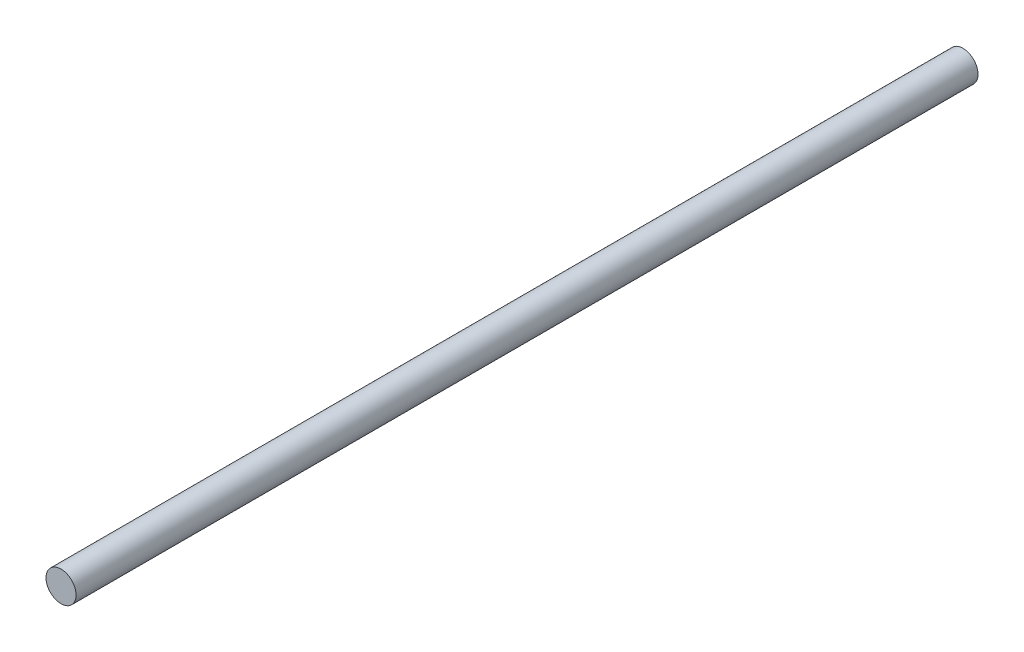
ISO-10303-21;
HEADER;
FILE_DESCRIPTION(('STEP AP214'),'2;1');
FILE_NAME('part.step','',(''),(''),'','','');
FILE_SCHEMA(('AUTOMOTIVE_DESIGN { 1 0 10303 214 1 1 1 1 }'));
ENDSEC;
DATA;
#1=APPLICATION_CONTEXT('core data for automotive mechanical design processes');
#2=APPLICATION_PROTOCOL_DEFINITION('international standard','automotive_design',2000,#1);
#3=PRODUCT_CONTEXT('',#1,'mechanical');
#4=PRODUCT('Part','Part','',(#3));
#5=PRODUCT_RELATED_PRODUCT_CATEGORY('part','',(#4));
#6=PRODUCT_DEFINITION_FORMATION('','',#4);
#7=PRODUCT_DEFINITION_CONTEXT('part definition',#1,'design');
#8=PRODUCT_DEFINITION('design','',#6,#7);
#9=PRODUCT_DEFINITION_SHAPE('','',#8);
#10=(LENGTH_UNIT() NAMED_UNIT(*) SI_UNIT(.MILLI.,.METRE.));
#11=(NAMED_UNIT(*) PLANE_ANGLE_UNIT() SI_UNIT($,.RADIAN.));
#12=(NAMED_UNIT(*) SI_UNIT($,.STERADIAN.) SOLID_ANGLE_UNIT());
#13=UNCERTAINTY_MEASURE_WITH_UNIT(LENGTH_MEASURE(1.E-05),#10,'distance_accuracy_value','');
#14=(GEOMETRIC_REPRESENTATION_CONTEXT(3) GLOBAL_UNCERTAINTY_ASSIGNED_CONTEXT((#13)) GLOBAL_UNIT_ASSIGNED_CONTEXT((#10,
#11,#12)) REPRESENTATION_CONTEXT('',''));
#15=CARTESIAN_POINT('',(0.,0.,0.));
#16=DIRECTION('',(0.,0.,1.));
#17=DIRECTION('',(1.,0.,0.));
#18=AXIS2_PLACEMENT_3D('',#15,#16,#17);
#19=CARTESIAN_POINT('',(0.,0.,90.));
#20=DIRECTION('',(0.,0.,-1.));
#21=DIRECTION('',(-1.,0.,0.));
#22=AXIS2_PLACEMENT_3D('',#19,#20,#21);
#23=CYLINDRICAL_SURFACE('',#22,1.5);
#24=CARTESIAN_POINT('',(0.,0.,90.));
#25=DIRECTION('',(0.,0.,1.));
#26=DIRECTION('',(1.,0.,0.));
#27=AXIS2_PLACEMENT_3D('',#24,#25,#26);
#28=CIRCLE('',#27,1.5);
#29=CARTESIAN_POINT('',(-1.5,0.,90.));
#30=VERTEX_POINT('',#29);
#31=EDGE_CURVE('E10',#30,#30,#28,.T.);
#32=CARTESIAN_POINT('',(0.,0.,0.));
#33=DIRECTION('',(0.,0.,1.));
#34=DIRECTION('',(1.,0.,0.));
#35=AXIS2_PLACEMENT_3D('',#32,#33,#34);
#36=CIRCLE('',#35,1.5);
#37=CARTESIAN_POINT('',(-1.5,0.,0.));
#38=VERTEX_POINT('',#37);
#39=EDGE_CURVE('E40',#38,#38,#36,.T.);
#40=CARTESIAN_POINT('',(-1.5,0.,90.));
#41=CARTESIAN_POINT('',(-1.5,0.,89.0625));
#42=CARTESIAN_POINT('',(-1.5,0.,88.125));
#43=CARTESIAN_POINT('',(-1.5,0.,86.25));
#44=CARTESIAN_POINT('',(-1.5,0.,85.3125));
#45=CARTESIAN_POINT('',(-1.5,0.,83.4375));
#46=CARTESIAN_POINT('',(-1.5,0.,82.5));
#47=CARTESIAN_POINT('',(-1.5,0.,80.625));
#48=CARTESIAN_POINT('',(-1.5,0.,79.6875));
#49=CARTESIAN_POINT('',(-1.5,0.,77.8125));
#50=CARTESIAN_POINT('',(-1.5,0.,76.875));
#51=CARTESIAN_POINT('',(-1.5,0.,75.));
#52=CARTESIAN_POINT('',(-1.5,0.,74.0625));
#53=CARTESIAN_POINT('',(-1.5,0.,72.1875));
#54=CARTESIAN_POINT('',(-1.5,0.,71.25));
#55=CARTESIAN_POINT('',(-1.5,0.,69.375));
#56=CARTESIAN_POINT('',(-1.5,0.,68.4375));
#57=CARTESIAN_POINT('',(-1.5,0.,66.5625));
#58=CARTESIAN_POINT('',(-1.5,0.,65.625));
#59=CARTESIAN_POINT('',(-1.5,0.,63.75));
#60=CARTESIAN_POINT('',(-1.5,0.,62.8125));
#61=CARTESIAN_POINT('',(-1.5,0.,60.9375));
#62=CARTESIAN_POINT('',(-1.5,0.,60.));
#63=CARTESIAN_POINT('',(-1.5,0.,58.125));
#64=CARTESIAN_POINT('',(-1.5,0.,57.1875));
#65=CARTESIAN_POINT('',(-1.5,0.,55.3125));
#66=CARTESIAN_POINT('',(-1.5,0.,54.375));
#67=CARTESIAN_POINT('',(-1.5,0.,52.5));
#68=CARTESIAN_POINT('',(-1.5,0.,51.5625));
#69=CARTESIAN_POINT('',(-1.5,0.,49.6875));
#70=CARTESIAN_POINT('',(-1.5,0.,48.75));
#71=CARTESIAN_POINT('',(-1.5,0.,46.875));
#72=CARTESIAN_POINT('',(-1.5,0.,45.9375));
#73=CARTESIAN_POINT('',(-1.5,0.,44.0625));
#74=CARTESIAN_POINT('',(-1.5,0.,43.125));
#75=CARTESIAN_POINT('',(-1.5,0.,41.25));
#76=CARTESIAN_POINT('',(-1.5,0.,40.3125));
#77=CARTESIAN_POINT('',(-1.5,0.,38.4375));
#78=CARTESIAN_POINT('',(-1.5,0.,37.5));
#79=CARTESIAN_POINT('',(-1.5,0.,35.625));
#80=CARTESIAN_POINT('',(-1.5,0.,34.6875));
#81=CARTESIAN_POINT('',(-1.5,0.,32.8125));
#82=CARTESIAN_POINT('',(-1.5,0.,31.875));
#83=CARTESIAN_POINT('',(-1.5,0.,30.));
#84=CARTESIAN_POINT('',(-1.5,0.,29.0625));
#85=CARTESIAN_POINT('',(-1.5,0.,27.1875));
#86=CARTESIAN_POINT('',(-1.5,0.,26.25));
#87=CARTESIAN_POINT('',(-1.5,0.,24.375));
#88=CARTESIAN_POINT('',(-1.5,0.,23.4375));
#89=CARTESIAN_POINT('',(-1.5,0.,21.5625));
#90=CARTESIAN_POINT('',(-1.5,0.,20.625));
#91=CARTESIAN_POINT('',(-1.5,0.,18.75));
#92=CARTESIAN_POINT('',(-1.5,0.,17.8125));
#93=CARTESIAN_POINT('',(-1.5,0.,15.9375));
#94=CARTESIAN_POINT('',(-1.5,0.,15.));
#95=CARTESIAN_POINT('',(-1.5,0.,13.125));
#96=CARTESIAN_POINT('',(-1.5,0.,12.1875));
#97=CARTESIAN_POINT('',(-1.5,0.,10.3125));
#98=CARTESIAN_POINT('',(-1.5,0.,9.37499999999999));
#99=CARTESIAN_POINT('',(-1.5,0.,7.49999999999999));
#100=CARTESIAN_POINT('',(-1.5,0.,6.56249999999999));
#101=CARTESIAN_POINT('',(-1.5,0.,4.68749999999999));
#102=CARTESIAN_POINT('',(-1.5,0.,3.74999999999998));
#103=CARTESIAN_POINT('',(-1.5,0.,1.87499999999998));
#104=CARTESIAN_POINT('',(-1.5,0.,0.937499999999986));
#105=CARTESIAN_POINT('',(-1.5,0.,0.));
#106=B_SPLINE_CURVE_WITH_KNOTS('',3,(#40,#41,#42,#43,#44,#45,#46,#47,#48,#49,#50,#51,#52,#53,
#54,#55,#56,#57,#58,#59,#60,#61,#62,#63,#64,#65,#66,#67,#68,#69,#70,#71,#72,#73,#74,#75,#76,#77,
#78,#79,#80,#81,#82,#83,#84,#85,#86,#87,#88,#89,#90,#91,#92,#93,#94,#95,#96,#97,#98,#99,#100,
#101,#102,#103,#104,#105),.UNSPECIFIED.,.F.,.F.,(4,2,2,2,2,2,2,2,2,2,2,2,2,2,2,2,2,2,2,2,2,2,2,
2,2,2,2,2,2,2,2,2,4),(0.,2.81250000000001,5.62500000000001,8.43750000000001,11.25,14.0625,
16.875,19.6875,22.5,25.3125,28.125,30.9375,33.75,36.5625,39.375,42.1875,45.,47.8125,50.625,
53.4375,56.25,59.0625,61.875,64.6875,67.5,70.3125,73.125,75.9375,78.75,81.5625,84.375,87.1875,
90.),.UNSPECIFIED.);
#107=EDGE_CURVE('BSEAM37',#30,#38,#106,.T.);
#108=ORIENTED_EDGE('',*,*,#31,.F.);
#109=ORIENTED_EDGE('',*,*,#39,.T.);
#110=ORIENTED_EDGE('',*,*,#107,.T.);
#111=ORIENTED_EDGE('',*,*,#107,.F.);
#112=EDGE_LOOP('',(#108,#110,#109,#111));
#113=FACE_BOUND('',#112,.T.);
#114=ADVANCED_FACE('F37',(#113),#23,.T.);
#115=CARTESIAN_POINT('',(0.,0.,90.));
#116=DIRECTION('',(0.,0.,1.));
#117=DIRECTION('',(1.,0.,0.));
#118=AXIS2_PLACEMENT_3D('',#115,#116,#117);
#119=PLANE('',#118);
#120=ORIENTED_EDGE('',*,*,#31,.T.);
#121=EDGE_LOOP('',(#120));
#122=FACE_BOUND('',#121,.T.);
#123=ADVANCED_FACE('F54',(#122),#119,.T.);
#124=CARTESIAN_POINT('',(0.,0.,0.));
#125=DIRECTION('',(0.,0.,1.));
#126=DIRECTION('',(1.,0.,0.));
#127=AXIS2_PLACEMENT_3D('',#124,#125,#126);
#128=PLANE('',#127);
#129=ORIENTED_EDGE('',*,*,#39,.F.);
#130=EDGE_LOOP('',(#129));
#131=FACE_BOUND('',#130,.T.);
#132=ADVANCED_FACE('F52',(#131),#128,.F.);
#133=CLOSED_SHELL('',(#114,#123,#132));
#134=MANIFOLD_SOLID_BREP('B2',#133);
#135=ADVANCED_BREP_SHAPE_REPRESENTATION('',(#18,#134),#14);
#136=SHAPE_DEFINITION_REPRESENTATION(#9,#135);
ENDSEC;
END-ISO-10303-21;
